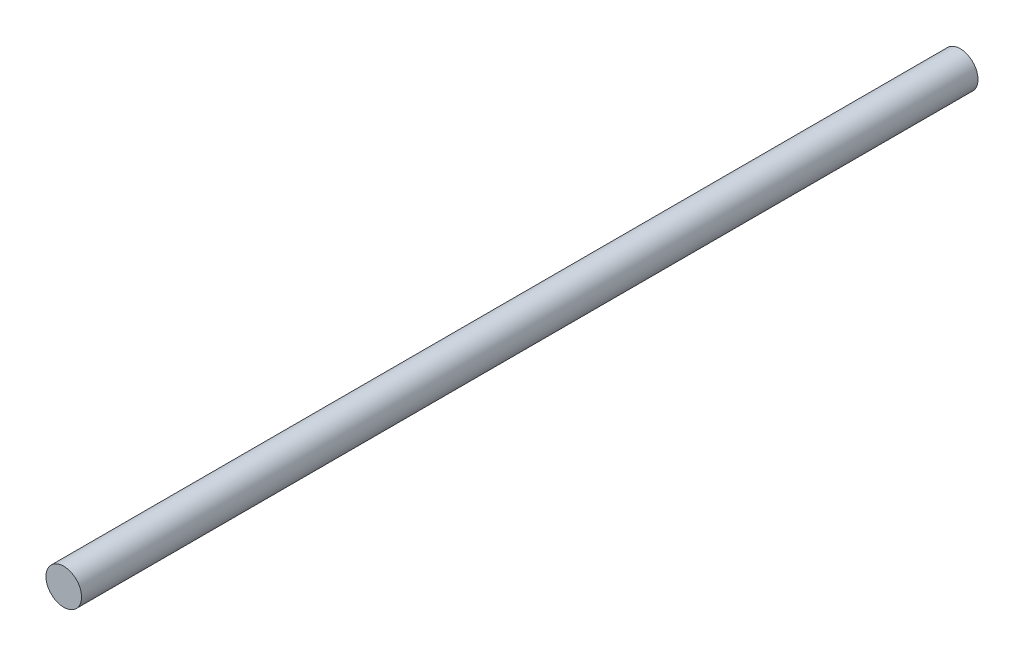
ISO-10303-21;
HEADER;
FILE_DESCRIPTION(('STEP AP214'),'2;1');
FILE_NAME('part.step','',(''),(''),'','','');
FILE_SCHEMA(('AUTOMOTIVE_DESIGN { 1 0 10303 214 1 1 1 1 }'));
ENDSEC;
DATA;
#1=APPLICATION_CONTEXT('core data for automotive mechanical design processes');
#2=APPLICATION_PROTOCOL_DEFINITION('international standard','automotive_design',2000,#1);
#3=PRODUCT_CONTEXT('',#1,'mechanical');
#4=PRODUCT('Part','Part','',(#3));
#5=PRODUCT_RELATED_PRODUCT_CATEGORY('part','',(#4));
#6=PRODUCT_DEFINITION_FORMATION('','',#4);
#7=PRODUCT_DEFINITION_CONTEXT('part definition',#1,'design');
#8=PRODUCT_DEFINITION('design','',#6,#7);
#9=PRODUCT_DEFINITION_SHAPE('','',#8);
#10=(LENGTH_UNIT() NAMED_UNIT(*) SI_UNIT(.MILLI.,.METRE.));
#11=(NAMED_UNIT(*) PLANE_ANGLE_UNIT() SI_UNIT($,.RADIAN.));
#12=(NAMED_UNIT(*) SI_UNIT($,.STERADIAN.) SOLID_ANGLE_UNIT());
#13=UNCERTAINTY_MEASURE_WITH_UNIT(LENGTH_MEASURE(1.E-05),#10,'distance_accuracy_value','');
#14=(GEOMETRIC_REPRESENTATION_CONTEXT(3) GLOBAL_UNCERTAINTY_ASSIGNED_CONTEXT((#13)) GLOBAL_UNIT_ASSIGNED_CONTEXT((#10,
#11,#12)) REPRESENTATION_CONTEXT('',''));
#15=CARTESIAN_POINT('',(0.,0.,0.));
#16=DIRECTION('',(0.,0.,1.));
#17=DIRECTION('',(1.,0.,0.));
#18=AXIS2_PLACEMENT_3D('',#15,#16,#17);
#19=CARTESIAN_POINT('',(0.,0.,40.));
#20=DIRECTION('',(0.,0.,-1.));
#21=DIRECTION('',(-1.,0.,0.));
#22=AXIS2_PLACEMENT_3D('',#19,#20,#21);
#23=CYLINDRICAL_SURFACE('',#22,0.79375);
#24=CARTESIAN_POINT('',(0.,0.,40.));
#25=DIRECTION('',(0.,0.,1.));
#26=DIRECTION('',(1.,0.,0.));
#27=AXIS2_PLACEMENT_3D('',#24,#25,#26);
#28=CIRCLE('',#27,0.79375);
#29=CARTESIAN_POINT('',(0.79375,0.,40.));
#30=VERTEX_POINT('',#29);
#31=EDGE_CURVE('E10',#30,#30,#28,.T.);
#32=ORIENTED_EDGE('',*,*,#31,.F.);
#33=EDGE_LOOP('',(#32));
#34=FACE_BOUND('',#33,.T.);
#35=CARTESIAN_POINT('',(0.,0.,0.));
#36=DIRECTION('',(0.,0.,1.));
#37=DIRECTION('',(1.,0.,0.));
#38=AXIS2_PLACEMENT_3D('',#35,#36,#37);
#39=CIRCLE('',#38,0.79375);
#40=CARTESIAN_POINT('',(0.79375,0.,0.));
#41=VERTEX_POINT('',#40);
#42=EDGE_CURVE('E33',#41,#41,#39,.T.);
#43=ORIENTED_EDGE('',*,*,#42,.T.);
#44=EDGE_LOOP('',(#43));
#45=FACE_BOUND('',#44,.T.);
#46=ADVANCED_FACE('F30',(#34,#45),#23,.T.);
#47=CARTESIAN_POINT('',(0.,0.,40.));
#48=DIRECTION('',(0.,0.,1.));
#49=DIRECTION('',(1.,0.,0.));
#50=AXIS2_PLACEMENT_3D('',#47,#48,#49);
#51=PLANE('',#50);
#52=ORIENTED_EDGE('',*,*,#31,.T.);
#53=EDGE_LOOP('',(#52));
#54=FACE_BOUND('',#53,.T.);
#55=ADVANCED_FACE('F45',(#54),#51,.T.);
#56=CARTESIAN_POINT('',(0.,0.,0.));
#57=DIRECTION('',(0.,0.,1.));
#58=DIRECTION('',(1.,0.,0.));
#59=AXIS2_PLACEMENT_3D('',#56,#57,#58);
#60=PLANE('',#59);
#61=ORIENTED_EDGE('',*,*,#42,.F.);
#62=EDGE_LOOP('',(#61));
#63=FACE_BOUND('',#62,.T.);
#64=ADVANCED_FACE('F43',(#63),#60,.F.);
#65=CLOSED_SHELL('',(#46,#55,#64));
#66=MANIFOLD_SOLID_BREP('B2',#65);
#67=ADVANCED_BREP_SHAPE_REPRESENTATION('',(#18,#66),#14);
#68=SHAPE_DEFINITION_REPRESENTATION(#9,#67);
ENDSEC;
END-ISO-10303-21;
